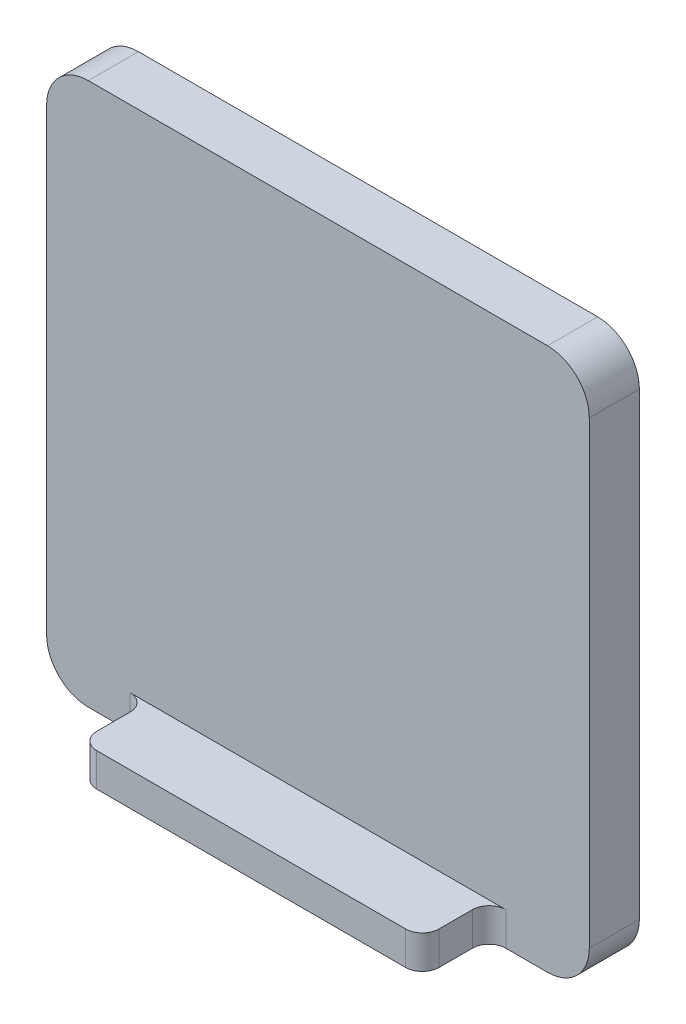
ISO-10303-21;
HEADER;
FILE_DESCRIPTION(('STEP AP214'),'2;1');
FILE_NAME('part.step','',(''),(''),'','','');
FILE_SCHEMA(('AUTOMOTIVE_DESIGN { 1 0 10303 214 1 1 1 1 }'));
ENDSEC;
DATA;
#1=APPLICATION_CONTEXT('core data for automotive mechanical design processes');
#2=APPLICATION_PROTOCOL_DEFINITION('international standard','automotive_design',2000,#1);
#3=PRODUCT_CONTEXT('',#1,'mechanical');
#4=PRODUCT('Part','Part','',(#3));
#5=PRODUCT_RELATED_PRODUCT_CATEGORY('part','',(#4));
#6=PRODUCT_DEFINITION_FORMATION('','',#4);
#7=PRODUCT_DEFINITION_CONTEXT('part definition',#1,'design');
#8=PRODUCT_DEFINITION('design','',#6,#7);
#9=PRODUCT_DEFINITION_SHAPE('','',#8);
#10=(LENGTH_UNIT() NAMED_UNIT(*) SI_UNIT(.MILLI.,.METRE.));
#11=(NAMED_UNIT(*) PLANE_ANGLE_UNIT() SI_UNIT($,.RADIAN.));
#12=(NAMED_UNIT(*) SI_UNIT($,.STERADIAN.) SOLID_ANGLE_UNIT());
#13=UNCERTAINTY_MEASURE_WITH_UNIT(LENGTH_MEASURE(1.E-05),#10,'distance_accuracy_value','');
#14=(GEOMETRIC_REPRESENTATION_CONTEXT(3) GLOBAL_UNCERTAINTY_ASSIGNED_CONTEXT((#13)) GLOBAL_UNIT_ASSIGNED_CONTEXT((#10,
#11,#12)) REPRESENTATION_CONTEXT('',''));
#15=CARTESIAN_POINT('',(0.,0.,0.));
#16=DIRECTION('',(0.,0.,1.));
#17=DIRECTION('',(1.,0.,0.));
#18=AXIS2_PLACEMENT_3D('',#15,#16,#17);
#19=CARTESIAN_POINT('',(32.5,32.5,6.));
#20=DIRECTION('',(-1.,0.,0.));
#21=DIRECTION('',(0.,-1.,0.));
#22=AXIS2_PLACEMENT_3D('',#19,#20,#21);
#23=PLANE('',#22);
#24=DIRECTION('',(0.,1.,0.));
#25=VECTOR('',#24,1.);
#26=CARTESIAN_POINT('',(32.5,32.5,6.));
#27=LINE('',#26,#25);
#28=CARTESIAN_POINT('',(32.5,-27.5,6.));
#29=VERTEX_POINT('',#28);
#30=CARTESIAN_POINT('',(32.5,27.5,6.));
#31=VERTEX_POINT('',#30);
#32=EDGE_CURVE('E174',#29,#31,#27,.T.);
#33=ORIENTED_EDGE('',*,*,#32,.F.);
#34=DIRECTION('',(0.,0.,-1.));
#35=VECTOR('',#34,1.);
#36=CARTESIAN_POINT('',(32.5,-27.5,6.));
#37=LINE('',#36,#35);
#38=CARTESIAN_POINT('',(32.5,-27.5,0.));
#39=VERTEX_POINT('',#38);
#40=EDGE_CURVE('E157',#29,#39,#37,.T.);
#41=ORIENTED_EDGE('',*,*,#40,.T.);
#42=DIRECTION('',(0.,1.,0.));
#43=VECTOR('',#42,1.);
#44=CARTESIAN_POINT('',(32.5,32.5,0.));
#45=LINE('',#44,#43);
#46=CARTESIAN_POINT('',(32.5,27.5,0.));
#47=VERTEX_POINT('',#46);
#48=EDGE_CURVE('E171',#39,#47,#45,.T.);
#49=ORIENTED_EDGE('',*,*,#48,.T.);
#50=DIRECTION('',(0.,0.,-1.));
#51=VECTOR('',#50,1.);
#52=CARTESIAN_POINT('',(32.5,27.5,6.));
#53=LINE('',#52,#51);
#54=EDGE_CURVE('E177',#47,#31,#53,.F.);
#55=ORIENTED_EDGE('',*,*,#54,.T.);
#56=EDGE_LOOP('',(#33,#41,#49,#55));
#57=FACE_BOUND('',#56,.T.);
#58=ADVANCED_FACE('F39',(#57),#23,.F.);
#59=CARTESIAN_POINT('',(-32.5,32.5,6.));
#60=DIRECTION('',(0.,-1.,0.));
#61=DIRECTION('',(0.,0.,-1.));
#62=AXIS2_PLACEMENT_3D('',#59,#60,#61);
#63=PLANE('',#62);
#64=DIRECTION('',(-1.,0.,0.));
#65=VECTOR('',#64,1.);
#66=CARTESIAN_POINT('',(-32.5,32.5,6.));
#67=LINE('',#66,#65);
#68=CARTESIAN_POINT('',(27.5,32.5,6.));
#69=VERTEX_POINT('',#68);
#70=CARTESIAN_POINT('',(-27.5,32.5,6.));
#71=VERTEX_POINT('',#70);
#72=EDGE_CURVE('E329',#69,#71,#67,.T.);
#73=ORIENTED_EDGE('',*,*,#72,.F.);
#74=DIRECTION('',(0.,0.,-1.));
#75=VECTOR('',#74,1.);
#76=CARTESIAN_POINT('',(27.5,32.5,6.));
#77=LINE('',#76,#75);
#78=CARTESIAN_POINT('',(27.5,32.5,0.));
#79=VERTEX_POINT('',#78);
#80=EDGE_CURVE('E238',#69,#79,#77,.T.);
#81=ORIENTED_EDGE('',*,*,#80,.T.);
#82=DIRECTION('',(-1.,0.,0.));
#83=VECTOR('',#82,1.);
#84=CARTESIAN_POINT('',(-32.5,32.5,0.));
#85=LINE('',#84,#83);
#86=CARTESIAN_POINT('',(-27.5,32.5,0.));
#87=VERTEX_POINT('',#86);
#88=EDGE_CURVE('E183',#79,#87,#85,.T.);
#89=ORIENTED_EDGE('',*,*,#88,.T.);
#90=DIRECTION('',(0.,0.,-1.));
#91=VECTOR('',#90,1.);
#92=CARTESIAN_POINT('',(-27.5,32.5,6.));
#93=LINE('',#92,#91);
#94=EDGE_CURVE('E235',#87,#71,#93,.F.);
#95=ORIENTED_EDGE('',*,*,#94,.T.);
#96=EDGE_LOOP('',(#73,#81,#89,#95));
#97=FACE_BOUND('',#96,.T.);
#98=ADVANCED_FACE('F358',(#97),#63,.F.);
#99=CARTESIAN_POINT('',(-32.5,32.5,6.));
#100=DIRECTION('',(1.,0.,0.));
#101=DIRECTION('',(0.,1.,0.));
#102=AXIS2_PLACEMENT_3D('',#99,#100,#101);
#103=PLANE('',#102);
#104=DIRECTION('',(0.,-1.,0.));
#105=VECTOR('',#104,1.);
#106=CARTESIAN_POINT('',(-32.5,32.5,0.));
#107=LINE('',#106,#105);
#108=CARTESIAN_POINT('',(-32.5,27.5,0.));
#109=VERTEX_POINT('',#108);
#110=CARTESIAN_POINT('',(-32.5,-27.5,0.));
#111=VERTEX_POINT('',#110);
#112=EDGE_CURVE('E189',#109,#111,#107,.T.);
#113=ORIENTED_EDGE('',*,*,#112,.T.);
#114=DIRECTION('',(0.,0.,-1.));
#115=VECTOR('',#114,1.);
#116=CARTESIAN_POINT('',(-32.5,-27.5,6.));
#117=LINE('',#116,#115);
#118=CARTESIAN_POINT('',(-32.5,-27.5,6.));
#119=VERTEX_POINT('',#118);
#120=EDGE_CURVE('E232',#111,#119,#117,.F.);
#121=ORIENTED_EDGE('',*,*,#120,.T.);
#122=DIRECTION('',(0.,-1.,0.));
#123=VECTOR('',#122,1.);
#124=CARTESIAN_POINT('',(-32.5,32.5,6.));
#125=LINE('',#124,#123);
#126=CARTESIAN_POINT('',(-32.5,27.5,6.));
#127=VERTEX_POINT('',#126);
#128=EDGE_CURVE('E332',#127,#119,#125,.T.);
#129=ORIENTED_EDGE('',*,*,#128,.F.);
#130=DIRECTION('',(0.,0.,-1.));
#131=VECTOR('',#130,1.);
#132=CARTESIAN_POINT('',(-32.5,27.5,6.));
#133=LINE('',#132,#131);
#134=EDGE_CURVE('E228',#127,#109,#133,.T.);
#135=ORIENTED_EDGE('',*,*,#134,.T.);
#136=EDGE_LOOP('',(#113,#121,#129,#135));
#137=FACE_BOUND('',#136,.T.);
#138=ADVANCED_FACE('F343',(#137),#103,.F.);
#139=CARTESIAN_POINT('',(-32.5,-32.5,6.));
#140=DIRECTION('',(0.,1.,0.));
#141=DIRECTION('',(0.,0.,1.));
#142=AXIS2_PLACEMENT_3D('',#139,#140,#141);
#143=PLANE('',#142);
#144=DIRECTION('',(0.,0.,-1.));
#145=VECTOR('',#144,1.);
#146=CARTESIAN_POINT('',(20.5,-32.5,14.));
#147=LINE('',#146,#145);
#148=CARTESIAN_POINT('',(20.5,-32.5,12.));
#149=VERTEX_POINT('',#148);
#150=CARTESIAN_POINT('',(20.5,-32.5,8.));
#151=VERTEX_POINT('',#150);
#152=EDGE_CURVE('E191',#149,#151,#147,.T.);
#153=ORIENTED_EDGE('',*,*,#152,.F.);
#154=CARTESIAN_POINT('',(18.5,-32.5,12.));
#155=DIRECTION('',(0.,1.,0.));
#156=DIRECTION('',(0.,0.,1.));
#157=AXIS2_PLACEMENT_3D('',#154,#155,#156);
#158=CIRCLE('',#157,2.);
#159=CARTESIAN_POINT('',(18.5,-32.5,14.));
#160=VERTEX_POINT('',#159);
#161=EDGE_CURVE('E272',#149,#160,#158,.F.);
#162=ORIENTED_EDGE('',*,*,#161,.T.);
#163=DIRECTION('',(1.,0.,0.));
#164=VECTOR('',#163,1.);
#165=CARTESIAN_POINT('',(-20.5,-32.5,14.));
#166=LINE('',#165,#164);
#167=CARTESIAN_POINT('',(-18.5,-32.5,14.));
#168=VERTEX_POINT('',#167);
#169=EDGE_CURVE('E320',#168,#160,#166,.T.);
#170=ORIENTED_EDGE('',*,*,#169,.F.);
#171=CARTESIAN_POINT('',(-18.5,-32.5,12.));
#172=DIRECTION('',(0.,1.,0.));
#173=DIRECTION('',(0.,0.,1.));
#174=AXIS2_PLACEMENT_3D('',#171,#172,#173);
#175=CIRCLE('',#174,2.);
#176=CARTESIAN_POINT('',(-20.5,-32.5,12.));
#177=VERTEX_POINT('',#176);
#178=EDGE_CURVE('E62',#168,#177,#175,.F.);
#179=ORIENTED_EDGE('',*,*,#178,.T.);
#180=DIRECTION('',(0.,0.,-1.));
#181=VECTOR('',#180,1.);
#182=CARTESIAN_POINT('',(-20.5,-32.5,14.));
#183=LINE('',#182,#181);
#184=CARTESIAN_POINT('',(-20.5,-32.5,8.));
#185=VERTEX_POINT('',#184);
#186=EDGE_CURVE('E184',#177,#185,#183,.T.);
#187=ORIENTED_EDGE('',*,*,#186,.T.);
#188=CARTESIAN_POINT('',(-22.5,-32.5,8.));
#189=DIRECTION('',(0.,1.,0.));
#190=DIRECTION('',(0.,0.,1.));
#191=AXIS2_PLACEMENT_3D('',#188,#189,#190);
#192=CIRCLE('',#191,2.);
#193=CARTESIAN_POINT('',(-22.5,-32.5,6.));
#194=VERTEX_POINT('',#193);
#195=EDGE_CURVE('E48',#185,#194,#192,.T.);
#196=ORIENTED_EDGE('',*,*,#195,.T.);
#197=DIRECTION('',(1.,0.,0.));
#198=VECTOR('',#197,1.);
#199=CARTESIAN_POINT('',(-32.5,-32.5,6.));
#200=LINE('',#199,#198);
#201=CARTESIAN_POINT('',(-27.5,-32.5,6.));
#202=VERTEX_POINT('',#201);
#203=EDGE_CURVE('E194',#202,#194,#200,.T.);
#204=ORIENTED_EDGE('',*,*,#203,.F.);
#205=DIRECTION('',(0.,0.,-1.));
#206=VECTOR('',#205,1.);
#207=CARTESIAN_POINT('',(-27.5,-32.5,6.));
#208=LINE('',#207,#206);
#209=CARTESIAN_POINT('',(-27.5,-32.5,0.));
#210=VERTEX_POINT('',#209);
#211=EDGE_CURVE('E165',#202,#210,#208,.T.);
#212=ORIENTED_EDGE('',*,*,#211,.T.);
#213=DIRECTION('',(1.,0.,0.));
#214=VECTOR('',#213,1.);
#215=CARTESIAN_POINT('',(-32.5,-32.5,0.));
#216=LINE('',#215,#214);
#217=CARTESIAN_POINT('',(27.5,-32.5,0.));
#218=VERTEX_POINT('',#217);
#219=EDGE_CURVE('E200',#210,#218,#216,.T.);
#220=ORIENTED_EDGE('',*,*,#219,.T.);
#221=DIRECTION('',(0.,0.,-1.));
#222=VECTOR('',#221,1.);
#223=CARTESIAN_POINT('',(27.5,-32.5,6.));
#224=LINE('',#223,#222);
#225=CARTESIAN_POINT('',(27.5,-32.5,6.));
#226=VERTEX_POINT('',#225);
#227=EDGE_CURVE('E159',#218,#226,#224,.F.);
#228=ORIENTED_EDGE('',*,*,#227,.T.);
#229=CARTESIAN_POINT('',(22.5,-32.5,6.));
#230=VERTEX_POINT('',#229);
#231=EDGE_CURVE('E299',#230,#226,#200,.T.);
#232=ORIENTED_EDGE('',*,*,#231,.F.);
#233=CARTESIAN_POINT('',(22.5,-32.5,8.));
#234=DIRECTION('',(0.,1.,0.));
#235=DIRECTION('',(0.,0.,1.));
#236=AXIS2_PLACEMENT_3D('',#233,#234,#235);
#237=CIRCLE('',#236,2.);
#238=EDGE_CURVE('E285',#230,#151,#237,.T.);
#239=ORIENTED_EDGE('',*,*,#238,.T.);
#240=EDGE_LOOP('',(#153,#162,#170,#179,#187,#196,#204,#212,#220,#228,#232,#239));
#241=FACE_BOUND('',#240,.T.);
#242=ADVANCED_FACE('F291',(#241),#143,.F.);
#243=CARTESIAN_POINT('',(0.,0.,6.));
#244=DIRECTION('',(0.,0.,1.));
#245=DIRECTION('',(1.,0.,0.));
#246=AXIS2_PLACEMENT_3D('',#243,#244,#245);
#247=PLANE('',#246);
#248=DIRECTION('',(-1.,0.,0.));
#249=VECTOR('',#248,1.);
#250=CARTESIAN_POINT('',(-20.5,-28.5,6.));
#251=LINE('',#250,#249);
#252=CARTESIAN_POINT('',(22.5,-28.5,6.));
#253=VERTEX_POINT('',#252);
#254=CARTESIAN_POINT('',(-22.5,-28.5,6.));
#255=VERTEX_POINT('',#254);
#256=EDGE_CURVE('E307',#253,#255,#251,.T.);
#257=ORIENTED_EDGE('',*,*,#256,.F.);
#258=DIRECTION('',(0.,1.,0.));
#259=VECTOR('',#258,1.);
#260=CARTESIAN_POINT('',(22.5,0.,6.));
#261=LINE('',#260,#259);
#262=EDGE_CURVE('E253',#253,#230,#261,.F.);
#263=ORIENTED_EDGE('',*,*,#262,.T.);
#264=ORIENTED_EDGE('',*,*,#231,.T.);
#265=CARTESIAN_POINT('',(27.5,-27.5,6.));
#266=DIRECTION('',(0.,0.,1.));
#267=DIRECTION('',(1.,0.,0.));
#268=AXIS2_PLACEMENT_3D('',#265,#266,#267);
#269=CIRCLE('',#268,5.);
#270=EDGE_CURVE('E225',#226,#29,#269,.T.);
#271=ORIENTED_EDGE('',*,*,#270,.T.);
#272=ORIENTED_EDGE('',*,*,#32,.T.);
#273=CARTESIAN_POINT('',(27.5,27.5,6.));
#274=DIRECTION('',(0.,0.,1.));
#275=DIRECTION('',(1.,0.,0.));
#276=AXIS2_PLACEMENT_3D('',#273,#274,#275);
#277=CIRCLE('',#276,5.);
#278=EDGE_CURVE('E219',#31,#69,#277,.T.);
#279=ORIENTED_EDGE('',*,*,#278,.T.);
#280=ORIENTED_EDGE('',*,*,#72,.T.);
#281=CARTESIAN_POINT('',(-27.5,27.5,6.));
#282=DIRECTION('',(0.,0.,1.));
#283=DIRECTION('',(1.,0.,0.));
#284=AXIS2_PLACEMENT_3D('',#281,#282,#283);
#285=CIRCLE('',#284,5.);
#286=EDGE_CURVE('E216',#71,#127,#285,.T.);
#287=ORIENTED_EDGE('',*,*,#286,.T.);
#288=ORIENTED_EDGE('',*,*,#128,.T.);
#289=CARTESIAN_POINT('',(-27.5,-27.5,6.));
#290=DIRECTION('',(0.,0.,1.));
#291=DIRECTION('',(1.,0.,0.));
#292=AXIS2_PLACEMENT_3D('',#289,#290,#291);
#293=CIRCLE('',#292,5.);
#294=EDGE_CURVE('E222',#119,#202,#293,.T.);
#295=ORIENTED_EDGE('',*,*,#294,.T.);
#296=ORIENTED_EDGE('',*,*,#203,.T.);
#297=DIRECTION('',(0.,-1.,0.));
#298=VECTOR('',#297,1.);
#299=CARTESIAN_POINT('',(-22.5,0.,6.));
#300=LINE('',#299,#298);
#301=EDGE_CURVE('E249',#194,#255,#300,.F.);
#302=ORIENTED_EDGE('',*,*,#301,.T.);
#303=EDGE_LOOP('',(#257,#263,#264,#271,#272,#279,#280,#287,#288,#295,#296,#302));
#304=FACE_BOUND('',#303,.T.);
#305=ADVANCED_FACE('F294',(#304),#247,.T.);
#306=CARTESIAN_POINT('',(0.,0.,0.));
#307=DIRECTION('',(0.,0.,1.));
#308=DIRECTION('',(1.,0.,0.));
#309=AXIS2_PLACEMENT_3D('',#306,#307,#308);
#310=PLANE('',#309);
#311=ORIENTED_EDGE('',*,*,#48,.F.);
#312=CARTESIAN_POINT('',(27.5,-27.5,0.));
#313=DIRECTION('',(0.,0.,1.));
#314=DIRECTION('',(1.,0.,0.));
#315=AXIS2_PLACEMENT_3D('',#312,#313,#314);
#316=CIRCLE('',#315,5.);
#317=EDGE_CURVE('E153',#39,#218,#316,.F.);
#318=ORIENTED_EDGE('',*,*,#317,.T.);
#319=ORIENTED_EDGE('',*,*,#219,.F.);
#320=CARTESIAN_POINT('',(-27.5,-27.5,0.));
#321=DIRECTION('',(0.,0.,1.));
#322=DIRECTION('',(1.,0.,0.));
#323=AXIS2_PLACEMENT_3D('',#320,#321,#322);
#324=CIRCLE('',#323,5.);
#325=EDGE_CURVE('E166',#210,#111,#324,.F.);
#326=ORIENTED_EDGE('',*,*,#325,.T.);
#327=ORIENTED_EDGE('',*,*,#112,.F.);
#328=CARTESIAN_POINT('',(-27.5,27.5,0.));
#329=DIRECTION('',(0.,0.,1.));
#330=DIRECTION('',(1.,0.,0.));
#331=AXIS2_PLACEMENT_3D('',#328,#329,#330);
#332=CIRCLE('',#331,5.);
#333=EDGE_CURVE('E176',#109,#87,#332,.F.);
#334=ORIENTED_EDGE('',*,*,#333,.T.);
#335=ORIENTED_EDGE('',*,*,#88,.F.);
#336=CARTESIAN_POINT('',(27.5,27.5,0.));
#337=DIRECTION('',(0.,0.,1.));
#338=DIRECTION('',(1.,0.,0.));
#339=AXIS2_PLACEMENT_3D('',#336,#337,#338);
#340=CIRCLE('',#339,5.);
#341=EDGE_CURVE('E181',#79,#47,#340,.F.);
#342=ORIENTED_EDGE('',*,*,#341,.T.);
#343=EDGE_LOOP('',(#311,#318,#319,#326,#327,#334,#335,#342));
#344=FACE_BOUND('',#343,.T.);
#345=ADVANCED_FACE('F179',(#344),#310,.F.);
#346=CARTESIAN_POINT('',(27.5,-27.5,6.));
#347=DIRECTION('',(0.,0.,-1.));
#348=DIRECTION('',(-1.,0.,0.));
#349=AXIS2_PLACEMENT_3D('',#346,#347,#348);
#350=CYLINDRICAL_SURFACE('',#349,5.);
#351=ORIENTED_EDGE('',*,*,#270,.F.);
#352=ORIENTED_EDGE('',*,*,#227,.F.);
#353=ORIENTED_EDGE('',*,*,#317,.F.);
#354=ORIENTED_EDGE('',*,*,#40,.F.);
#355=EDGE_LOOP('',(#351,#352,#353,#354));
#356=FACE_BOUND('',#355,.T.);
#357=ADVANCED_FACE('F156',(#356),#350,.T.);
#358=CARTESIAN_POINT('',(-27.5,-27.5,6.));
#359=DIRECTION('',(0.,0.,-1.));
#360=DIRECTION('',(-1.,0.,0.));
#361=AXIS2_PLACEMENT_3D('',#358,#359,#360);
#362=CYLINDRICAL_SURFACE('',#361,5.);
#363=ORIENTED_EDGE('',*,*,#294,.F.);
#364=ORIENTED_EDGE('',*,*,#120,.F.);
#365=ORIENTED_EDGE('',*,*,#325,.F.);
#366=ORIENTED_EDGE('',*,*,#211,.F.);
#367=EDGE_LOOP('',(#363,#364,#365,#366));
#368=FACE_BOUND('',#367,.T.);
#369=ADVANCED_FACE('F345',(#368),#362,.T.);
#370=CARTESIAN_POINT('',(27.5,27.5,6.));
#371=DIRECTION('',(0.,0.,-1.));
#372=DIRECTION('',(-1.,0.,0.));
#373=AXIS2_PLACEMENT_3D('',#370,#371,#372);
#374=CYLINDRICAL_SURFACE('',#373,5.);
#375=ORIENTED_EDGE('',*,*,#278,.F.);
#376=ORIENTED_EDGE('',*,*,#54,.F.);
#377=ORIENTED_EDGE('',*,*,#341,.F.);
#378=ORIENTED_EDGE('',*,*,#80,.F.);
#379=EDGE_LOOP('',(#375,#376,#377,#378));
#380=FACE_BOUND('',#379,.T.);
#381=ADVANCED_FACE('F347',(#380),#374,.T.);
#382=CARTESIAN_POINT('',(-27.5,27.5,6.));
#383=DIRECTION('',(0.,0.,-1.));
#384=DIRECTION('',(-1.,0.,0.));
#385=AXIS2_PLACEMENT_3D('',#382,#383,#384);
#386=CYLINDRICAL_SURFACE('',#385,5.);
#387=ORIENTED_EDGE('',*,*,#286,.F.);
#388=ORIENTED_EDGE('',*,*,#94,.F.);
#389=ORIENTED_EDGE('',*,*,#333,.F.);
#390=ORIENTED_EDGE('',*,*,#134,.F.);
#391=EDGE_LOOP('',(#387,#388,#389,#390));
#392=FACE_BOUND('',#391,.T.);
#393=ADVANCED_FACE('F353',(#392),#386,.T.);
#394=CARTESIAN_POINT('',(-20.5,-32.5,14.));
#395=DIRECTION('',(1.,0.,0.));
#396=DIRECTION('',(0.,0.,-1.));
#397=AXIS2_PLACEMENT_3D('',#394,#395,#396);
#398=PLANE('',#397);
#399=ORIENTED_EDGE('',*,*,#186,.F.);
#400=DIRECTION('',(0.,-1.,0.));
#401=VECTOR('',#400,1.);
#402=CARTESIAN_POINT('',(-20.5,-32.5,12.));
#403=LINE('',#402,#401);
#404=CARTESIAN_POINT('',(-20.5,-28.5,12.));
#405=VERTEX_POINT('',#404);
#406=EDGE_CURVE('E278',#177,#405,#403,.F.);
#407=ORIENTED_EDGE('',*,*,#406,.T.);
#408=DIRECTION('',(0.,0.,-1.));
#409=VECTOR('',#408,1.);
#410=CARTESIAN_POINT('',(-20.5,-28.5,14.));
#411=LINE('',#410,#409);
#412=CARTESIAN_POINT('',(-20.5,-28.5,8.));
#413=VERTEX_POINT('',#412);
#414=EDGE_CURVE('E305',#405,#413,#411,.T.);
#415=ORIENTED_EDGE('',*,*,#414,.T.);
#416=DIRECTION('',(0.,-1.,0.));
#417=VECTOR('',#416,1.);
#418=CARTESIAN_POINT('',(-20.5,-32.5,8.));
#419=LINE('',#418,#417);
#420=EDGE_CURVE('E275',#413,#185,#419,.T.);
#421=ORIENTED_EDGE('',*,*,#420,.T.);
#422=EDGE_LOOP('',(#399,#407,#415,#421));
#423=FACE_BOUND('',#422,.T.);
#424=ADVANCED_FACE('F309',(#423),#398,.F.);
#425=CARTESIAN_POINT('',(20.5,-32.5,14.));
#426=DIRECTION('',(-1.,0.,0.));
#427=DIRECTION('',(0.,0.,1.));
#428=AXIS2_PLACEMENT_3D('',#425,#426,#427);
#429=PLANE('',#428);
#430=ORIENTED_EDGE('',*,*,#152,.T.);
#431=DIRECTION('',(0.,1.,0.));
#432=VECTOR('',#431,1.);
#433=CARTESIAN_POINT('',(20.5,-32.5,8.));
#434=LINE('',#433,#432);
#435=CARTESIAN_POINT('',(20.5,-28.5,8.));
#436=VERTEX_POINT('',#435);
#437=EDGE_CURVE('E245',#151,#436,#434,.T.);
#438=ORIENTED_EDGE('',*,*,#437,.T.);
#439=DIRECTION('',(0.,0.,-1.));
#440=VECTOR('',#439,1.);
#441=CARTESIAN_POINT('',(20.5,-28.5,14.));
#442=LINE('',#441,#440);
#443=CARTESIAN_POINT('',(20.5,-28.5,12.));
#444=VERTEX_POINT('',#443);
#445=EDGE_CURVE('E312',#444,#436,#442,.T.);
#446=ORIENTED_EDGE('',*,*,#445,.F.);
#447=DIRECTION('',(0.,1.,0.));
#448=VECTOR('',#447,1.);
#449=CARTESIAN_POINT('',(20.5,-32.5,12.));
#450=LINE('',#449,#448);
#451=EDGE_CURVE('E242',#444,#149,#450,.F.);
#452=ORIENTED_EDGE('',*,*,#451,.T.);
#453=EDGE_LOOP('',(#430,#438,#446,#452));
#454=FACE_BOUND('',#453,.T.);
#455=ADVANCED_FACE('F376',(#454),#429,.F.);
#456=CARTESIAN_POINT('',(-20.5,-28.5,14.));
#457=DIRECTION('',(0.,-1.,0.));
#458=DIRECTION('',(1.,0.,0.));
#459=AXIS2_PLACEMENT_3D('',#456,#457,#458);
#460=PLANE('',#459);
#461=DIRECTION('',(-1.,0.,0.));
#462=VECTOR('',#461,1.);
#463=CARTESIAN_POINT('',(-20.5,-28.5,14.));
#464=LINE('',#463,#462);
#465=CARTESIAN_POINT('',(18.5,-28.5,14.));
#466=VERTEX_POINT('',#465);
#467=CARTESIAN_POINT('',(-18.5,-28.5,14.));
#468=VERTEX_POINT('',#467);
#469=EDGE_CURVE('E313',#466,#468,#464,.T.);
#470=ORIENTED_EDGE('',*,*,#469,.F.);
#471=CARTESIAN_POINT('',(18.5,-28.5,12.));
#472=DIRECTION('',(0.,-1.,0.));
#473=DIRECTION('',(1.,0.,0.));
#474=AXIS2_PLACEMENT_3D('',#471,#472,#473);
#475=CIRCLE('',#474,2.);
#476=EDGE_CURVE('E267',#466,#444,#475,.F.);
#477=ORIENTED_EDGE('',*,*,#476,.T.);
#478=ORIENTED_EDGE('',*,*,#445,.T.);
#479=CARTESIAN_POINT('',(22.5,-28.5,8.));
#480=DIRECTION('',(0.,-1.,0.));
#481=DIRECTION('',(1.,0.,0.));
#482=AXIS2_PLACEMENT_3D('',#479,#480,#481);
#483=CIRCLE('',#482,2.);
#484=EDGE_CURVE('E281',#436,#253,#483,.T.);
#485=ORIENTED_EDGE('',*,*,#484,.T.);
#486=ORIENTED_EDGE('',*,*,#256,.T.);
#487=CARTESIAN_POINT('',(-22.5,-28.5,8.));
#488=DIRECTION('',(0.,-1.,0.));
#489=DIRECTION('',(1.,0.,0.));
#490=AXIS2_PLACEMENT_3D('',#487,#488,#489);
#491=CIRCLE('',#490,2.);
#492=EDGE_CURVE('E11',#255,#413,#491,.T.);
#493=ORIENTED_EDGE('',*,*,#492,.T.);
#494=ORIENTED_EDGE('',*,*,#414,.F.);
#495=CARTESIAN_POINT('',(-18.5,-28.5,12.));
#496=DIRECTION('',(0.,-1.,0.));
#497=DIRECTION('',(1.,0.,0.));
#498=AXIS2_PLACEMENT_3D('',#495,#496,#497);
#499=CIRCLE('',#498,2.);
#500=EDGE_CURVE('E264',#405,#468,#499,.F.);
#501=ORIENTED_EDGE('',*,*,#500,.T.);
#502=EDGE_LOOP('',(#470,#477,#478,#485,#486,#493,#494,#501));
#503=FACE_BOUND('',#502,.T.);
#504=ADVANCED_FACE('F304',(#503),#460,.F.);
#505=CARTESIAN_POINT('',(0.,0.,14.));
#506=DIRECTION('',(0.,0.,-1.));
#507=DIRECTION('',(-1.,0.,0.));
#508=AXIS2_PLACEMENT_3D('',#505,#506,#507);
#509=PLANE('',#508);
#510=ORIENTED_EDGE('',*,*,#169,.T.);
#511=DIRECTION('',(0.,1.,0.));
#512=VECTOR('',#511,1.);
#513=CARTESIAN_POINT('',(18.5,0.,14.));
#514=LINE('',#513,#512);
#515=EDGE_CURVE('E260',#160,#466,#514,.T.);
#516=ORIENTED_EDGE('',*,*,#515,.T.);
#517=ORIENTED_EDGE('',*,*,#469,.T.);
#518=DIRECTION('',(0.,-1.,0.));
#519=VECTOR('',#518,1.);
#520=CARTESIAN_POINT('',(-18.5,0.,14.));
#521=LINE('',#520,#519);
#522=EDGE_CURVE('E256',#468,#168,#521,.T.);
#523=ORIENTED_EDGE('',*,*,#522,.T.);
#524=EDGE_LOOP('',(#510,#516,#517,#523));
#525=FACE_BOUND('',#524,.T.);
#526=ADVANCED_FACE('F382',(#525),#509,.F.);
#527=CARTESIAN_POINT('',(22.5,-32.5,8.));
#528=DIRECTION('',(0.,1.,0.));
#529=DIRECTION('',(0.,0.,1.));
#530=AXIS2_PLACEMENT_3D('',#527,#528,#529);
#531=CYLINDRICAL_SURFACE('',#530,2.);
#532=ORIENTED_EDGE('',*,*,#238,.F.);
#533=ORIENTED_EDGE('',*,*,#262,.F.);
#534=ORIENTED_EDGE('',*,*,#484,.F.);
#535=ORIENTED_EDGE('',*,*,#437,.F.);
#536=EDGE_LOOP('',(#532,#533,#534,#535));
#537=FACE_BOUND('',#536,.T.);
#538=ADVANCED_FACE('F384',(#537),#531,.F.);
#539=CARTESIAN_POINT('',(18.5,0.,12.));
#540=DIRECTION('',(0.,1.,0.));
#541=DIRECTION('',(0.,0.,1.));
#542=AXIS2_PLACEMENT_3D('',#539,#540,#541);
#543=CYLINDRICAL_SURFACE('',#542,2.);
#544=ORIENTED_EDGE('',*,*,#161,.F.);
#545=ORIENTED_EDGE('',*,*,#451,.F.);
#546=ORIENTED_EDGE('',*,*,#476,.F.);
#547=ORIENTED_EDGE('',*,*,#515,.F.);
#548=EDGE_LOOP('',(#544,#545,#546,#547));
#549=FACE_BOUND('',#548,.T.);
#550=ADVANCED_FACE('F389',(#549),#543,.T.);
#551=CARTESIAN_POINT('',(-18.5,0.,12.));
#552=DIRECTION('',(0.,-1.,0.));
#553=DIRECTION('',(0.,0.,-1.));
#554=AXIS2_PLACEMENT_3D('',#551,#552,#553);
#555=CYLINDRICAL_SURFACE('',#554,2.);
#556=ORIENTED_EDGE('',*,*,#500,.F.);
#557=ORIENTED_EDGE('',*,*,#406,.F.);
#558=ORIENTED_EDGE('',*,*,#178,.F.);
#559=ORIENTED_EDGE('',*,*,#522,.F.);
#560=EDGE_LOOP('',(#556,#557,#558,#559));
#561=FACE_BOUND('',#560,.T.);
#562=ADVANCED_FACE('F403',(#561),#555,.T.);
#563=CARTESIAN_POINT('',(-22.5,-32.5,8.));
#564=DIRECTION('',(0.,-1.,0.));
#565=DIRECTION('',(0.,0.,-1.));
#566=AXIS2_PLACEMENT_3D('',#563,#564,#565);
#567=CYLINDRICAL_SURFACE('',#566,2.);
#568=ORIENTED_EDGE('',*,*,#492,.F.);
#569=ORIENTED_EDGE('',*,*,#301,.F.);
#570=ORIENTED_EDGE('',*,*,#195,.F.);
#571=ORIENTED_EDGE('',*,*,#420,.F.);
#572=EDGE_LOOP('',(#568,#569,#570,#571));
#573=FACE_BOUND('',#572,.T.);
#574=ADVANCED_FACE('F41',(#573),#567,.F.);
#575=CLOSED_SHELL('',(#58,#98,#138,#242,#305,#345,#357,#369,#381,#393,#424,#455,#504,#526,#538,
#550,#562,#574));
#576=MANIFOLD_SOLID_BREP('B2',#575);
#577=ADVANCED_BREP_SHAPE_REPRESENTATION('',(#18,#576),#14);
#578=SHAPE_DEFINITION_REPRESENTATION(#9,#577);
ENDSEC;
END-ISO-10303-21;
